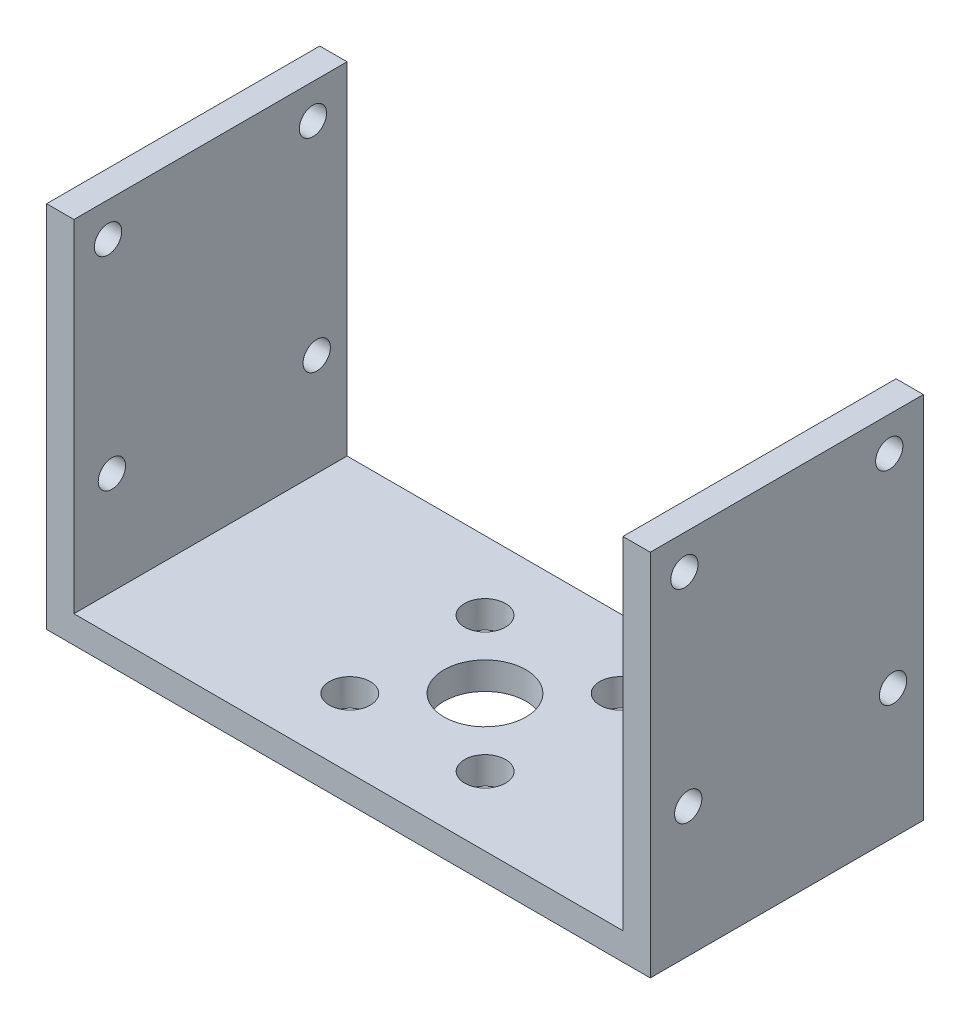
ISO-10303-21;
HEADER;
FILE_DESCRIPTION(('STEP AP214'),'2;1');
FILE_NAME('part.step','',(''),(''),'','','');
FILE_SCHEMA(('AUTOMOTIVE_DESIGN { 1 0 10303 214 1 1 1 1 }'));
ENDSEC;
DATA;
#1=APPLICATION_CONTEXT('core data for automotive mechanical design processes');
#2=APPLICATION_PROTOCOL_DEFINITION('international standard','automotive_design',2000,#1);
#3=PRODUCT_CONTEXT('',#1,'mechanical');
#4=PRODUCT('Part','Part','',(#3));
#5=PRODUCT_RELATED_PRODUCT_CATEGORY('part','',(#4));
#6=PRODUCT_DEFINITION_FORMATION('','',#4);
#7=PRODUCT_DEFINITION_CONTEXT('part definition',#1,'design');
#8=PRODUCT_DEFINITION('design','',#6,#7);
#9=PRODUCT_DEFINITION_SHAPE('','',#8);
#10=(LENGTH_UNIT() NAMED_UNIT(*) SI_UNIT(.MILLI.,.METRE.));
#11=(NAMED_UNIT(*) PLANE_ANGLE_UNIT() SI_UNIT($,.RADIAN.));
#12=(NAMED_UNIT(*) SI_UNIT($,.STERADIAN.) SOLID_ANGLE_UNIT());
#13=UNCERTAINTY_MEASURE_WITH_UNIT(LENGTH_MEASURE(1.E-05),#10,'distance_accuracy_value','');
#14=(GEOMETRIC_REPRESENTATION_CONTEXT(3) GLOBAL_UNCERTAINTY_ASSIGNED_CONTEXT((#13)) GLOBAL_UNIT_ASSIGNED_CONTEXT((#10,
#11,#12)) REPRESENTATION_CONTEXT('',''));
#15=CARTESIAN_POINT('',(0.,0.,0.));
#16=DIRECTION('',(0.,0.,1.));
#17=DIRECTION('',(1.,0.,0.));
#18=AXIS2_PLACEMENT_3D('',#15,#16,#17);
#19=CARTESIAN_POINT('',(0.,2.,0.));
#20=DIRECTION('',(0.,-1.,0.));
#21=DIRECTION('',(0.,0.,-1.));
#22=AXIS2_PLACEMENT_3D('',#19,#20,#21);
#23=PLANE('',#22);
#24=CARTESIAN_POINT('',(27.0495,2.,-14.9495));
#25=DIRECTION('',(0.,1.,0.));
#26=DIRECTION('',(0.,0.,1.));
#27=AXIS2_PLACEMENT_3D('',#24,#25,#26);
#28=CIRCLE('',#27,1.5);
#29=CARTESIAN_POINT('',(27.0495,2.,-13.4495));
#30=VERTEX_POINT('',#29);
#31=EDGE_CURVE('E205',#30,#30,#28,.T.);
#32=ORIENTED_EDGE('',*,*,#31,.F.);
#33=EDGE_LOOP('',(#32));
#34=FACE_BOUND('',#33,.T.);
#35=CARTESIAN_POINT('',(27.0495,2.,-5.0595));
#36=DIRECTION('',(0.,1.,0.));
#37=DIRECTION('',(0.,0.,1.));
#38=AXIS2_PLACEMENT_3D('',#35,#36,#37);
#39=CIRCLE('',#38,1.5);
#40=CARTESIAN_POINT('',(27.0495,2.,-3.5595));
#41=VERTEX_POINT('',#40);
#42=EDGE_CURVE('E212',#41,#41,#39,.T.);
#43=ORIENTED_EDGE('',*,*,#42,.F.);
#44=EDGE_LOOP('',(#43));
#45=FACE_BOUND('',#44,.T.);
#46=CARTESIAN_POINT('',(17.1505,2.,-5.0505));
#47=DIRECTION('',(0.,1.,0.));
#48=DIRECTION('',(0.,0.,1.));
#49=AXIS2_PLACEMENT_3D('',#46,#47,#48);
#50=CIRCLE('',#49,1.5);
#51=CARTESIAN_POINT('',(17.1505,2.,-3.5505));
#52=VERTEX_POINT('',#51);
#53=EDGE_CURVE('E209',#52,#52,#50,.T.);
#54=ORIENTED_EDGE('',*,*,#53,.F.);
#55=EDGE_LOOP('',(#54));
#56=FACE_BOUND('',#55,.T.);
#57=CARTESIAN_POINT('',(17.1505,2.,-14.9495));
#58=DIRECTION('',(0.,1.,0.));
#59=DIRECTION('',(0.,0.,1.));
#60=AXIS2_PLACEMENT_3D('',#57,#58,#59);
#61=CIRCLE('',#60,1.5);
#62=CARTESIAN_POINT('',(17.1505,2.,-13.4495));
#63=VERTEX_POINT('',#62);
#64=EDGE_CURVE('E206',#63,#63,#61,.T.);
#65=ORIENTED_EDGE('',*,*,#64,.F.);
#66=EDGE_LOOP('',(#65));
#67=FACE_BOUND('',#66,.T.);
#68=CARTESIAN_POINT('',(22.1,2.,-10.));
#69=DIRECTION('',(0.,1.,0.));
#70=DIRECTION('',(0.,0.,1.));
#71=AXIS2_PLACEMENT_3D('',#68,#69,#70);
#72=CIRCLE('',#71,2.99999999999999);
#73=CARTESIAN_POINT('',(22.1,2.,-7.00000000000001));
#74=VERTEX_POINT('',#73);
#75=EDGE_CURVE('E126',#74,#74,#72,.T.);
#76=ORIENTED_EDGE('',*,*,#75,.F.);
#77=EDGE_LOOP('',(#76));
#78=FACE_BOUND('',#77,.T.);
#79=DIRECTION('',(0.,0.,1.));
#80=VECTOR('',#79,1.);
#81=CARTESIAN_POINT('',(42.2,2.,-20.));
#82=LINE('',#81,#80);
#83=CARTESIAN_POINT('',(42.2,2.,-20.));
#84=VERTEX_POINT('',#83);
#85=CARTESIAN_POINT('',(42.2,2.,0.));
#86=VERTEX_POINT('',#85);
#87=EDGE_CURVE('E121',#84,#86,#82,.T.);
#88=ORIENTED_EDGE('',*,*,#87,.F.);
#89=DIRECTION('',(-1.,0.,0.));
#90=VECTOR('',#89,1.);
#91=CARTESIAN_POINT('',(0.,2.,-20.));
#92=LINE('',#91,#90);
#93=CARTESIAN_POINT('',(2.,2.,-20.));
#94=VERTEX_POINT('',#93);
#95=EDGE_CURVE('E154',#84,#94,#92,.T.);
#96=ORIENTED_EDGE('',*,*,#95,.T.);
#97=DIRECTION('',(0.,0.,-1.));
#98=VECTOR('',#97,1.);
#99=CARTESIAN_POINT('',(2.,2.,-20.));
#100=LINE('',#99,#98);
#101=CARTESIAN_POINT('',(2.,2.,0.));
#102=VERTEX_POINT('',#101);
#103=EDGE_CURVE('E52',#102,#94,#100,.T.);
#104=ORIENTED_EDGE('',*,*,#103,.F.);
#105=DIRECTION('',(1.,0.,0.));
#106=VECTOR('',#105,1.);
#107=CARTESIAN_POINT('',(0.,2.,0.));
#108=LINE('',#107,#106);
#109=EDGE_CURVE('E47',#102,#86,#108,.T.);
#110=ORIENTED_EDGE('',*,*,#109,.T.);
#111=EDGE_LOOP('',(#88,#96,#104,#110));
#112=FACE_BOUND('',#111,.T.);
#113=ADVANCED_FACE('F30',(#34,#45,#56,#67,#78,#112),#23,.F.);
#114=CARTESIAN_POINT('',(0.,2.,0.));
#115=DIRECTION('',(1.,0.,0.));
#116=DIRECTION('',(0.,0.,-1.));
#117=AXIS2_PLACEMENT_3D('',#114,#115,#116);
#118=PLANE('',#117);
#119=CARTESIAN_POINT('',(0.,9.50000000000001,-2.77964680806756));
#120=DIRECTION('',(-1.,0.,0.));
#121=DIRECTION('',(0.,0.,1.));
#122=AXIS2_PLACEMENT_3D('',#119,#120,#121);
#123=CIRCLE('',#122,1.);
#124=CARTESIAN_POINT('',(0.,9.50000000000001,-1.77964680806756));
#125=VERTEX_POINT('',#124);
#126=EDGE_CURVE('E276',#125,#125,#123,.T.);
#127=ORIENTED_EDGE('',*,*,#126,.F.);
#128=EDGE_LOOP('',(#127));
#129=FACE_BOUND('',#128,.T.);
#130=CARTESIAN_POINT('',(0.,24.5,-17.5));
#131=DIRECTION('',(-1.,0.,0.));
#132=DIRECTION('',(0.,0.,1.));
#133=AXIS2_PLACEMENT_3D('',#130,#131,#132);
#134=CIRCLE('',#133,1.);
#135=CARTESIAN_POINT('',(0.,24.5,-16.5));
#136=VERTEX_POINT('',#135);
#137=EDGE_CURVE('E280',#136,#136,#134,.T.);
#138=ORIENTED_EDGE('',*,*,#137,.F.);
#139=EDGE_LOOP('',(#138));
#140=FACE_BOUND('',#139,.T.);
#141=CARTESIAN_POINT('',(0.,9.50000000000001,-17.7796468080676));
#142=DIRECTION('',(-1.,0.,0.));
#143=DIRECTION('',(0.,0.,1.));
#144=AXIS2_PLACEMENT_3D('',#141,#142,#143);
#145=CIRCLE('',#144,1.);
#146=CARTESIAN_POINT('',(0.,9.50000000000001,-16.7796468080676));
#147=VERTEX_POINT('',#146);
#148=EDGE_CURVE('E284',#147,#147,#145,.T.);
#149=ORIENTED_EDGE('',*,*,#148,.F.);
#150=EDGE_LOOP('',(#149));
#151=FACE_BOUND('',#150,.T.);
#152=CARTESIAN_POINT('',(0.,24.5,-2.5));
#153=DIRECTION('',(-1.,0.,0.));
#154=DIRECTION('',(0.,0.,1.));
#155=AXIS2_PLACEMENT_3D('',#152,#153,#154);
#156=CIRCLE('',#155,1.);
#157=CARTESIAN_POINT('',(0.,24.5,-1.5));
#158=VERTEX_POINT('',#157);
#159=EDGE_CURVE('E287',#158,#158,#156,.T.);
#160=ORIENTED_EDGE('',*,*,#159,.F.);
#161=EDGE_LOOP('',(#160));
#162=FACE_BOUND('',#161,.T.);
#163=DIRECTION('',(0.,0.,1.));
#164=VECTOR('',#163,1.);
#165=CARTESIAN_POINT('',(0.,0.,0.));
#166=LINE('',#165,#164);
#167=CARTESIAN_POINT('',(0.,0.,-20.));
#168=VERTEX_POINT('',#167);
#169=CARTESIAN_POINT('',(0.,0.,0.));
#170=VERTEX_POINT('',#169);
#171=EDGE_CURVE('E152',#168,#170,#166,.T.);
#172=ORIENTED_EDGE('',*,*,#171,.T.);
#173=DIRECTION('',(0.,-1.,0.));
#174=VECTOR('',#173,1.);
#175=CARTESIAN_POINT('',(0.,2.,0.));
#176=LINE('',#175,#174);
#177=CARTESIAN_POINT('',(0.,27.,0.));
#178=VERTEX_POINT('',#177);
#179=EDGE_CURVE('E11',#178,#170,#176,.T.);
#180=ORIENTED_EDGE('',*,*,#179,.F.);
#181=DIRECTION('',(0.,0.,1.));
#182=VECTOR('',#181,1.);
#183=CARTESIAN_POINT('',(0.,27.,-20.));
#184=LINE('',#183,#182);
#185=CARTESIAN_POINT('',(0.,27.,-20.));
#186=VERTEX_POINT('',#185);
#187=EDGE_CURVE('E135',#186,#178,#184,.T.);
#188=ORIENTED_EDGE('',*,*,#187,.F.);
#189=DIRECTION('',(0.,-1.,0.));
#190=VECTOR('',#189,1.);
#191=CARTESIAN_POINT('',(0.,2.,-20.));
#192=LINE('',#191,#190);
#193=EDGE_CURVE('E106',#186,#168,#192,.T.);
#194=ORIENTED_EDGE('',*,*,#193,.T.);
#195=EDGE_LOOP('',(#172,#180,#188,#194));
#196=FACE_BOUND('',#195,.T.);
#197=ADVANCED_FACE('F32',(#129,#140,#151,#162,#196),#118,.F.);
#198=CARTESIAN_POINT('',(0.,2.,0.));
#199=DIRECTION('',(0.,0.,-1.));
#200=DIRECTION('',(-1.,0.,0.));
#201=AXIS2_PLACEMENT_3D('',#198,#199,#200);
#202=PLANE('',#201);
#203=DIRECTION('',(1.,0.,0.));
#204=VECTOR('',#203,1.);
#205=CARTESIAN_POINT('',(0.,0.,0.));
#206=LINE('',#205,#204);
#207=CARTESIAN_POINT('',(44.2,0.,0.));
#208=VERTEX_POINT('',#207);
#209=EDGE_CURVE('E159',#170,#208,#206,.T.);
#210=ORIENTED_EDGE('',*,*,#209,.T.);
#211=DIRECTION('',(0.,-1.,0.));
#212=VECTOR('',#211,1.);
#213=CARTESIAN_POINT('',(44.2,2.,0.));
#214=LINE('',#213,#212);
#215=CARTESIAN_POINT('',(44.2,27.,0.));
#216=VERTEX_POINT('',#215);
#217=EDGE_CURVE('E39',#216,#208,#214,.T.);
#218=ORIENTED_EDGE('',*,*,#217,.F.);
#219=DIRECTION('',(1.,0.,0.));
#220=VECTOR('',#219,1.);
#221=CARTESIAN_POINT('',(44.2,27.,0.));
#222=LINE('',#221,#220);
#223=CARTESIAN_POINT('',(42.2,27.,0.));
#224=VERTEX_POINT('',#223);
#225=EDGE_CURVE('E120',#224,#216,#222,.T.);
#226=ORIENTED_EDGE('',*,*,#225,.F.);
#227=DIRECTION('',(0.,-1.,0.));
#228=VECTOR('',#227,1.);
#229=CARTESIAN_POINT('',(42.2,27.,0.));
#230=LINE('',#229,#228);
#231=EDGE_CURVE('E130',#224,#86,#230,.T.);
#232=ORIENTED_EDGE('',*,*,#231,.T.);
#233=ORIENTED_EDGE('',*,*,#109,.F.);
#234=DIRECTION('',(0.,-1.,0.));
#235=VECTOR('',#234,1.);
#236=CARTESIAN_POINT('',(2.,27.,0.));
#237=LINE('',#236,#235);
#238=CARTESIAN_POINT('',(2.,27.,0.));
#239=VERTEX_POINT('',#238);
#240=EDGE_CURVE('E149',#239,#102,#237,.T.);
#241=ORIENTED_EDGE('',*,*,#240,.F.);
#242=DIRECTION('',(1.,0.,0.));
#243=VECTOR('',#242,1.);
#244=CARTESIAN_POINT('',(0.,27.,0.));
#245=LINE('',#244,#243);
#246=EDGE_CURVE('E138',#178,#239,#245,.T.);
#247=ORIENTED_EDGE('',*,*,#246,.F.);
#248=ORIENTED_EDGE('',*,*,#179,.T.);
#249=EDGE_LOOP('',(#210,#218,#226,#232,#233,#241,#247,#248));
#250=FACE_BOUND('',#249,.T.);
#251=ADVANCED_FACE('F234',(#250),#202,.F.);
#252=CARTESIAN_POINT('',(44.2,2.,0.));
#253=DIRECTION('',(-1.,0.,0.));
#254=DIRECTION('',(0.,0.,1.));
#255=AXIS2_PLACEMENT_3D('',#252,#253,#254);
#256=PLANE('',#255);
#257=CARTESIAN_POINT('',(44.2,9.50000000000001,-2.77964680806756));
#258=DIRECTION('',(-1.,0.,0.));
#259=DIRECTION('',(0.,0.,1.));
#260=AXIS2_PLACEMENT_3D('',#257,#258,#259);
#261=CIRCLE('',#260,1.);
#262=CARTESIAN_POINT('',(44.2,9.50000000000001,-1.77964680806756));
#263=VERTEX_POINT('',#262);
#264=EDGE_CURVE('E289',#263,#263,#261,.T.);
#265=ORIENTED_EDGE('',*,*,#264,.T.);
#266=EDGE_LOOP('',(#265));
#267=FACE_BOUND('',#266,.T.);
#268=CARTESIAN_POINT('',(44.2,24.5,-17.5));
#269=DIRECTION('',(-1.,0.,0.));
#270=DIRECTION('',(0.,0.,1.));
#271=AXIS2_PLACEMENT_3D('',#268,#269,#270);
#272=CIRCLE('',#271,1.);
#273=CARTESIAN_POINT('',(44.2,24.5,-16.5));
#274=VERTEX_POINT('',#273);
#275=EDGE_CURVE('E296',#274,#274,#272,.T.);
#276=ORIENTED_EDGE('',*,*,#275,.T.);
#277=EDGE_LOOP('',(#276));
#278=FACE_BOUND('',#277,.T.);
#279=CARTESIAN_POINT('',(44.2,9.50000000000001,-17.7796468080676));
#280=DIRECTION('',(-1.,0.,0.));
#281=DIRECTION('',(0.,0.,1.));
#282=AXIS2_PLACEMENT_3D('',#279,#280,#281);
#283=CIRCLE('',#282,1.);
#284=CARTESIAN_POINT('',(44.2,9.50000000000001,-16.7796468080676));
#285=VERTEX_POINT('',#284);
#286=EDGE_CURVE('E297',#285,#285,#283,.T.);
#287=ORIENTED_EDGE('',*,*,#286,.T.);
#288=EDGE_LOOP('',(#287));
#289=FACE_BOUND('',#288,.T.);
#290=CARTESIAN_POINT('',(44.2,24.5,-2.5));
#291=DIRECTION('',(-1.,0.,0.));
#292=DIRECTION('',(0.,0.,1.));
#293=AXIS2_PLACEMENT_3D('',#290,#291,#292);
#294=CIRCLE('',#293,1.);
#295=CARTESIAN_POINT('',(44.2,24.5,-1.5));
#296=VERTEX_POINT('',#295);
#297=EDGE_CURVE('E184',#296,#296,#294,.T.);
#298=ORIENTED_EDGE('',*,*,#297,.T.);
#299=EDGE_LOOP('',(#298));
#300=FACE_BOUND('',#299,.T.);
#301=DIRECTION('',(0.,0.,-1.));
#302=VECTOR('',#301,1.);
#303=CARTESIAN_POINT('',(44.2,0.,0.));
#304=LINE('',#303,#302);
#305=CARTESIAN_POINT('',(44.2,0.,-20.));
#306=VERTEX_POINT('',#305);
#307=EDGE_CURVE('E103',#208,#306,#304,.T.);
#308=ORIENTED_EDGE('',*,*,#307,.T.);
#309=DIRECTION('',(0.,-1.,0.));
#310=VECTOR('',#309,1.);
#311=CARTESIAN_POINT('',(44.2,2.,-20.));
#312=LINE('',#311,#310);
#313=CARTESIAN_POINT('',(44.2,27.,-20.));
#314=VERTEX_POINT('',#313);
#315=EDGE_CURVE('E96',#314,#306,#312,.T.);
#316=ORIENTED_EDGE('',*,*,#315,.F.);
#317=DIRECTION('',(0.,0.,-1.));
#318=VECTOR('',#317,1.);
#319=CARTESIAN_POINT('',(44.2,27.,-20.));
#320=LINE('',#319,#318);
#321=EDGE_CURVE('E101',#216,#314,#320,.T.);
#322=ORIENTED_EDGE('',*,*,#321,.F.);
#323=ORIENTED_EDGE('',*,*,#217,.T.);
#324=EDGE_LOOP('',(#308,#316,#322,#323));
#325=FACE_BOUND('',#324,.T.);
#326=ADVANCED_FACE('F98',(#267,#278,#289,#300,#325),#256,.F.);
#327=CARTESIAN_POINT('',(0.,2.,-20.));
#328=DIRECTION('',(0.,0.,1.));
#329=DIRECTION('',(1.,0.,0.));
#330=AXIS2_PLACEMENT_3D('',#327,#328,#329);
#331=PLANE('',#330);
#332=DIRECTION('',(-1.,0.,0.));
#333=VECTOR('',#332,1.);
#334=CARTESIAN_POINT('',(0.,0.,-20.));
#335=LINE('',#334,#333);
#336=EDGE_CURVE('E155',#306,#168,#335,.T.);
#337=ORIENTED_EDGE('',*,*,#336,.T.);
#338=ORIENTED_EDGE('',*,*,#193,.F.);
#339=DIRECTION('',(-1.,0.,0.));
#340=VECTOR('',#339,1.);
#341=CARTESIAN_POINT('',(0.,27.,-20.));
#342=LINE('',#341,#340);
#343=CARTESIAN_POINT('',(2.,27.,-20.));
#344=VERTEX_POINT('',#343);
#345=EDGE_CURVE('E142',#344,#186,#342,.T.);
#346=ORIENTED_EDGE('',*,*,#345,.F.);
#347=DIRECTION('',(0.,-1.,0.));
#348=VECTOR('',#347,1.);
#349=CARTESIAN_POINT('',(2.,27.,-20.));
#350=LINE('',#349,#348);
#351=EDGE_CURVE('E145',#344,#94,#350,.T.);
#352=ORIENTED_EDGE('',*,*,#351,.T.);
#353=ORIENTED_EDGE('',*,*,#95,.F.);
#354=DIRECTION('',(0.,-1.,0.));
#355=VECTOR('',#354,1.);
#356=CARTESIAN_POINT('',(42.2,27.,-20.));
#357=LINE('',#356,#355);
#358=CARTESIAN_POINT('',(42.2,27.,-20.));
#359=VERTEX_POINT('',#358);
#360=EDGE_CURVE('E112',#359,#84,#357,.T.);
#361=ORIENTED_EDGE('',*,*,#360,.F.);
#362=DIRECTION('',(-1.,0.,0.));
#363=VECTOR('',#362,1.);
#364=CARTESIAN_POINT('',(44.2,27.,-20.));
#365=LINE('',#364,#363);
#366=EDGE_CURVE('E109',#314,#359,#365,.T.);
#367=ORIENTED_EDGE('',*,*,#366,.F.);
#368=ORIENTED_EDGE('',*,*,#315,.T.);
#369=EDGE_LOOP('',(#337,#338,#346,#352,#353,#361,#367,#368));
#370=FACE_BOUND('',#369,.T.);
#371=ADVANCED_FACE('F110',(#370),#331,.F.);
#372=CARTESIAN_POINT('',(0.,0.,0.));
#373=DIRECTION('',(0.,-1.,0.));
#374=DIRECTION('',(0.,0.,-1.));
#375=AXIS2_PLACEMENT_3D('',#372,#373,#374);
#376=PLANE('',#375);
#377=CARTESIAN_POINT('',(27.0495,0.,-14.9495));
#378=DIRECTION('',(0.,-1.,0.));
#379=DIRECTION('',(0.,0.,-1.));
#380=AXIS2_PLACEMENT_3D('',#377,#378,#379);
#381=CIRCLE('',#380,1.5);
#382=CARTESIAN_POINT('',(27.0495,0.,-16.4495));
#383=VERTEX_POINT('',#382);
#384=EDGE_CURVE('E123',#383,#383,#381,.T.);
#385=ORIENTED_EDGE('',*,*,#384,.F.);
#386=EDGE_LOOP('',(#385));
#387=FACE_BOUND('',#386,.T.);
#388=CARTESIAN_POINT('',(27.0495,0.,-5.0595));
#389=DIRECTION('',(0.,-1.,0.));
#390=DIRECTION('',(0.,0.,-1.));
#391=AXIS2_PLACEMENT_3D('',#388,#389,#390);
#392=CIRCLE('',#391,1.5);
#393=CARTESIAN_POINT('',(27.0495,0.,-6.5595));
#394=VERTEX_POINT('',#393);
#395=EDGE_CURVE('E175',#394,#394,#392,.T.);
#396=ORIENTED_EDGE('',*,*,#395,.F.);
#397=EDGE_LOOP('',(#396));
#398=FACE_BOUND('',#397,.T.);
#399=CARTESIAN_POINT('',(17.1505,0.,-5.0505));
#400=DIRECTION('',(0.,-1.,0.));
#401=DIRECTION('',(0.,0.,-1.));
#402=AXIS2_PLACEMENT_3D('',#399,#400,#401);
#403=CIRCLE('',#402,1.5);
#404=CARTESIAN_POINT('',(17.1505,0.,-6.5505));
#405=VERTEX_POINT('',#404);
#406=EDGE_CURVE('E172',#405,#405,#403,.T.);
#407=ORIENTED_EDGE('',*,*,#406,.F.);
#408=EDGE_LOOP('',(#407));
#409=FACE_BOUND('',#408,.T.);
#410=CARTESIAN_POINT('',(17.1505,0.,-14.9495));
#411=DIRECTION('',(0.,-1.,0.));
#412=DIRECTION('',(0.,0.,-1.));
#413=AXIS2_PLACEMENT_3D('',#410,#411,#412);
#414=CIRCLE('',#413,1.5);
#415=CARTESIAN_POINT('',(17.1505,0.,-16.4495));
#416=VERTEX_POINT('',#415);
#417=EDGE_CURVE('E169',#416,#416,#414,.T.);
#418=ORIENTED_EDGE('',*,*,#417,.F.);
#419=EDGE_LOOP('',(#418));
#420=FACE_BOUND('',#419,.T.);
#421=CARTESIAN_POINT('',(22.1,0.,-10.));
#422=DIRECTION('',(0.,-1.,0.));
#423=DIRECTION('',(0.,0.,-1.));
#424=AXIS2_PLACEMENT_3D('',#421,#422,#423);
#425=CIRCLE('',#424,2.99999999999999);
#426=CARTESIAN_POINT('',(22.1,0.,-13.));
#427=VERTEX_POINT('',#426);
#428=EDGE_CURVE('E166',#427,#427,#425,.T.);
#429=ORIENTED_EDGE('',*,*,#428,.F.);
#430=EDGE_LOOP('',(#429));
#431=FACE_BOUND('',#430,.T.);
#432=ORIENTED_EDGE('',*,*,#171,.F.);
#433=ORIENTED_EDGE('',*,*,#336,.F.);
#434=ORIENTED_EDGE('',*,*,#307,.F.);
#435=ORIENTED_EDGE('',*,*,#209,.F.);
#436=EDGE_LOOP('',(#432,#433,#434,#435));
#437=FACE_BOUND('',#436,.T.);
#438=ADVANCED_FACE('F237',(#387,#398,#409,#420,#431,#437),#376,.T.);
#439=CARTESIAN_POINT('',(2.,27.,-20.));
#440=DIRECTION('',(-1.,0.,0.));
#441=DIRECTION('',(0.,0.,1.));
#442=AXIS2_PLACEMENT_3D('',#439,#440,#441);
#443=PLANE('',#442);
#444=CARTESIAN_POINT('',(2.,9.50000000000001,-2.77964680806756));
#445=DIRECTION('',(-1.,0.,0.));
#446=DIRECTION('',(0.,0.,1.));
#447=AXIS2_PLACEMENT_3D('',#444,#445,#446);
#448=CIRCLE('',#447,1.);
#449=CARTESIAN_POINT('',(2.,9.50000000000001,-1.77964680806756));
#450=VERTEX_POINT('',#449);
#451=EDGE_CURVE('E202',#450,#450,#448,.T.);
#452=ORIENTED_EDGE('',*,*,#451,.T.);
#453=EDGE_LOOP('',(#452));
#454=FACE_BOUND('',#453,.T.);
#455=CARTESIAN_POINT('',(2.,24.5,-17.5));
#456=DIRECTION('',(-1.,0.,0.));
#457=DIRECTION('',(0.,0.,1.));
#458=AXIS2_PLACEMENT_3D('',#455,#456,#457);
#459=CIRCLE('',#458,1.);
#460=CARTESIAN_POINT('',(2.,24.5,-16.5));
#461=VERTEX_POINT('',#460);
#462=EDGE_CURVE('E190',#461,#461,#459,.T.);
#463=ORIENTED_EDGE('',*,*,#462,.T.);
#464=EDGE_LOOP('',(#463));
#465=FACE_BOUND('',#464,.T.);
#466=CARTESIAN_POINT('',(2.,9.50000000000001,-17.7796468080676));
#467=DIRECTION('',(-1.,0.,0.));
#468=DIRECTION('',(0.,0.,1.));
#469=AXIS2_PLACEMENT_3D('',#466,#467,#468);
#470=CIRCLE('',#469,1.);
#471=CARTESIAN_POINT('',(2.,9.50000000000001,-16.7796468080676));
#472=VERTEX_POINT('',#471);
#473=EDGE_CURVE('E187',#472,#472,#470,.T.);
#474=ORIENTED_EDGE('',*,*,#473,.T.);
#475=EDGE_LOOP('',(#474));
#476=FACE_BOUND('',#475,.T.);
#477=CARTESIAN_POINT('',(2.,24.5,-2.5));
#478=DIRECTION('',(-1.,0.,0.));
#479=DIRECTION('',(0.,0.,1.));
#480=AXIS2_PLACEMENT_3D('',#477,#478,#479);
#481=CIRCLE('',#480,1.);
#482=CARTESIAN_POINT('',(2.,24.5,-1.5));
#483=VERTEX_POINT('',#482);
#484=EDGE_CURVE('E183',#483,#483,#481,.T.);
#485=ORIENTED_EDGE('',*,*,#484,.T.);
#486=EDGE_LOOP('',(#485));
#487=FACE_BOUND('',#486,.T.);
#488=ORIENTED_EDGE('',*,*,#103,.T.);
#489=ORIENTED_EDGE('',*,*,#351,.F.);
#490=DIRECTION('',(0.,0.,-1.));
#491=VECTOR('',#490,1.);
#492=CARTESIAN_POINT('',(2.,27.,-20.));
#493=LINE('',#492,#491);
#494=EDGE_CURVE('E140',#239,#344,#493,.T.);
#495=ORIENTED_EDGE('',*,*,#494,.F.);
#496=ORIENTED_EDGE('',*,*,#240,.T.);
#497=EDGE_LOOP('',(#488,#489,#495,#496));
#498=FACE_BOUND('',#497,.T.);
#499=ADVANCED_FACE('F248',(#454,#465,#476,#487,#498),#443,.F.);
#500=CARTESIAN_POINT('',(0.,27.,0.));
#501=DIRECTION('',(0.,1.,0.));
#502=DIRECTION('',(0.,0.,1.));
#503=AXIS2_PLACEMENT_3D('',#500,#501,#502);
#504=PLANE('',#503);
#505=ORIENTED_EDGE('',*,*,#187,.T.);
#506=ORIENTED_EDGE('',*,*,#246,.T.);
#507=ORIENTED_EDGE('',*,*,#494,.T.);
#508=ORIENTED_EDGE('',*,*,#345,.T.);
#509=EDGE_LOOP('',(#505,#506,#507,#508));
#510=FACE_BOUND('',#509,.T.);
#511=ADVANCED_FACE('F243',(#510),#504,.T.);
#512=CARTESIAN_POINT('',(42.2,27.,-20.));
#513=DIRECTION('',(1.,0.,0.));
#514=DIRECTION('',(0.,0.,-1.));
#515=AXIS2_PLACEMENT_3D('',#512,#513,#514);
#516=PLANE('',#515);
#517=CARTESIAN_POINT('',(42.2,9.50000000000001,-2.77964680806756));
#518=DIRECTION('',(1.,0.,0.));
#519=DIRECTION('',(0.,0.,-1.));
#520=AXIS2_PLACEMENT_3D('',#517,#518,#519);
#521=CIRCLE('',#520,1.);
#522=CARTESIAN_POINT('',(42.2,9.50000000000001,-3.77964680806756));
#523=VERTEX_POINT('',#522);
#524=EDGE_CURVE('E34',#523,#523,#521,.T.);
#525=ORIENTED_EDGE('',*,*,#524,.T.);
#526=EDGE_LOOP('',(#525));
#527=FACE_BOUND('',#526,.T.);
#528=CARTESIAN_POINT('',(42.2,24.5,-17.5));
#529=DIRECTION('',(1.,0.,0.));
#530=DIRECTION('',(0.,0.,-1.));
#531=AXIS2_PLACEMENT_3D('',#528,#529,#530);
#532=CIRCLE('',#531,1.);
#533=CARTESIAN_POINT('',(42.2,24.5,-18.5));
#534=VERTEX_POINT('',#533);
#535=EDGE_CURVE('E188',#534,#534,#532,.T.);
#536=ORIENTED_EDGE('',*,*,#535,.T.);
#537=EDGE_LOOP('',(#536));
#538=FACE_BOUND('',#537,.T.);
#539=CARTESIAN_POINT('',(42.2,9.50000000000001,-17.7796468080676));
#540=DIRECTION('',(1.,0.,0.));
#541=DIRECTION('',(0.,0.,-1.));
#542=AXIS2_PLACEMENT_3D('',#539,#540,#541);
#543=CIRCLE('',#542,1.);
#544=CARTESIAN_POINT('',(42.2,9.50000000000001,-18.7796468080676));
#545=VERTEX_POINT('',#544);
#546=EDGE_CURVE('E185',#545,#545,#543,.T.);
#547=ORIENTED_EDGE('',*,*,#546,.T.);
#548=EDGE_LOOP('',(#547));
#549=FACE_BOUND('',#548,.T.);
#550=CARTESIAN_POINT('',(42.2,24.5,-2.5));
#551=DIRECTION('',(1.,0.,0.));
#552=DIRECTION('',(0.,0.,-1.));
#553=AXIS2_PLACEMENT_3D('',#550,#551,#552);
#554=CIRCLE('',#553,1.);
#555=CARTESIAN_POINT('',(42.2,24.5,-3.5));
#556=VERTEX_POINT('',#555);
#557=EDGE_CURVE('E180',#556,#556,#554,.T.);
#558=ORIENTED_EDGE('',*,*,#557,.T.);
#559=EDGE_LOOP('',(#558));
#560=FACE_BOUND('',#559,.T.);
#561=ORIENTED_EDGE('',*,*,#87,.T.);
#562=ORIENTED_EDGE('',*,*,#231,.F.);
#563=DIRECTION('',(0.,0.,1.));
#564=VECTOR('',#563,1.);
#565=CARTESIAN_POINT('',(42.2,27.,-20.));
#566=LINE('',#565,#564);
#567=EDGE_CURVE('E115',#359,#224,#566,.T.);
#568=ORIENTED_EDGE('',*,*,#567,.F.);
#569=ORIENTED_EDGE('',*,*,#360,.T.);
#570=EDGE_LOOP('',(#561,#562,#568,#569));
#571=FACE_BOUND('',#570,.T.);
#572=ADVANCED_FACE('F232',(#527,#538,#549,#560,#571),#516,.F.);
#573=CARTESIAN_POINT('',(0.,27.,0.));
#574=DIRECTION('',(0.,-1.,0.));
#575=DIRECTION('',(0.,0.,-1.));
#576=AXIS2_PLACEMENT_3D('',#573,#574,#575);
#577=PLANE('',#576);
#578=ORIENTED_EDGE('',*,*,#321,.T.);
#579=ORIENTED_EDGE('',*,*,#366,.T.);
#580=ORIENTED_EDGE('',*,*,#567,.T.);
#581=ORIENTED_EDGE('',*,*,#225,.T.);
#582=EDGE_LOOP('',(#578,#579,#580,#581));
#583=FACE_BOUND('',#582,.T.);
#584=ADVANCED_FACE('F118',(#583),#577,.F.);
#585=CARTESIAN_POINT('',(22.1,-23.,-10.));
#586=DIRECTION('',(0.,1.,0.));
#587=DIRECTION('',(0.,0.,1.));
#588=AXIS2_PLACEMENT_3D('',#585,#586,#587);
#589=CYLINDRICAL_SURFACE('',#588,2.99999999999999);
#590=ORIENTED_EDGE('',*,*,#428,.T.);
#591=EDGE_LOOP('',(#590));
#592=FACE_BOUND('',#591,.T.);
#593=ORIENTED_EDGE('',*,*,#75,.T.);
#594=EDGE_LOOP('',(#593));
#595=FACE_BOUND('',#594,.T.);
#596=ADVANCED_FACE('F460',(#592,#595),#589,.F.);
#597=CARTESIAN_POINT('',(17.1505,-23.,-14.9495));
#598=DIRECTION('',(0.,1.,0.));
#599=DIRECTION('',(0.,0.,1.));
#600=AXIS2_PLACEMENT_3D('',#597,#598,#599);
#601=CYLINDRICAL_SURFACE('',#600,1.5);
#602=ORIENTED_EDGE('',*,*,#417,.T.);
#603=EDGE_LOOP('',(#602));
#604=FACE_BOUND('',#603,.T.);
#605=ORIENTED_EDGE('',*,*,#64,.T.);
#606=EDGE_LOOP('',(#605));
#607=FACE_BOUND('',#606,.T.);
#608=ADVANCED_FACE('F450',(#604,#607),#601,.F.);
#609=CARTESIAN_POINT('',(17.1505,-23.,-5.0505));
#610=DIRECTION('',(0.,1.,0.));
#611=DIRECTION('',(0.,0.,1.));
#612=AXIS2_PLACEMENT_3D('',#609,#610,#611);
#613=CYLINDRICAL_SURFACE('',#612,1.5);
#614=ORIENTED_EDGE('',*,*,#406,.T.);
#615=EDGE_LOOP('',(#614));
#616=FACE_BOUND('',#615,.T.);
#617=ORIENTED_EDGE('',*,*,#53,.T.);
#618=EDGE_LOOP('',(#617));
#619=FACE_BOUND('',#618,.T.);
#620=ADVANCED_FACE('F440',(#616,#619),#613,.F.);
#621=CARTESIAN_POINT('',(27.0495,-23.,-5.0595));
#622=DIRECTION('',(0.,1.,0.));
#623=DIRECTION('',(0.,0.,1.));
#624=AXIS2_PLACEMENT_3D('',#621,#622,#623);
#625=CYLINDRICAL_SURFACE('',#624,1.5);
#626=ORIENTED_EDGE('',*,*,#395,.T.);
#627=EDGE_LOOP('',(#626));
#628=FACE_BOUND('',#627,.T.);
#629=ORIENTED_EDGE('',*,*,#42,.T.);
#630=EDGE_LOOP('',(#629));
#631=FACE_BOUND('',#630,.T.);
#632=ADVANCED_FACE('F328',(#628,#631),#625,.F.);
#633=CARTESIAN_POINT('',(27.0495,-23.,-14.9495));
#634=DIRECTION('',(0.,1.,0.));
#635=DIRECTION('',(0.,0.,1.));
#636=AXIS2_PLACEMENT_3D('',#633,#634,#635);
#637=CYLINDRICAL_SURFACE('',#636,1.5);
#638=ORIENTED_EDGE('',*,*,#384,.T.);
#639=EDGE_LOOP('',(#638));
#640=FACE_BOUND('',#639,.T.);
#641=ORIENTED_EDGE('',*,*,#31,.T.);
#642=EDGE_LOOP('',(#641));
#643=FACE_BOUND('',#642,.T.);
#644=ADVANCED_FACE('F217',(#640,#643),#637,.F.);
#645=CARTESIAN_POINT('',(44.2,24.5,-2.5));
#646=DIRECTION('',(-1.,0.,0.));
#647=DIRECTION('',(0.,0.,1.));
#648=AXIS2_PLACEMENT_3D('',#645,#646,#647);
#649=CYLINDRICAL_SURFACE('',#648,1.);
#650=ORIENTED_EDGE('',*,*,#297,.F.);
#651=EDGE_LOOP('',(#650));
#652=FACE_BOUND('',#651,.T.);
#653=ORIENTED_EDGE('',*,*,#557,.F.);
#654=EDGE_LOOP('',(#653));
#655=FACE_BOUND('',#654,.T.);
#656=ADVANCED_FACE('F311',(#652,#655),#649,.F.);
#657=CARTESIAN_POINT('',(44.2,9.50000000000001,-17.7796468080676));
#658=DIRECTION('',(-1.,0.,0.));
#659=DIRECTION('',(0.,0.,1.));
#660=AXIS2_PLACEMENT_3D('',#657,#658,#659);
#661=CYLINDRICAL_SURFACE('',#660,1.);
#662=ORIENTED_EDGE('',*,*,#286,.F.);
#663=EDGE_LOOP('',(#662));
#664=FACE_BOUND('',#663,.T.);
#665=ORIENTED_EDGE('',*,*,#546,.F.);
#666=EDGE_LOOP('',(#665));
#667=FACE_BOUND('',#666,.T.);
#668=ADVANCED_FACE('F307',(#664,#667),#661,.F.);
#669=CARTESIAN_POINT('',(44.2,24.5,-17.5));
#670=DIRECTION('',(-1.,0.,0.));
#671=DIRECTION('',(0.,0.,1.));
#672=AXIS2_PLACEMENT_3D('',#669,#670,#671);
#673=CYLINDRICAL_SURFACE('',#672,1.);
#674=ORIENTED_EDGE('',*,*,#275,.F.);
#675=EDGE_LOOP('',(#674));
#676=FACE_BOUND('',#675,.T.);
#677=ORIENTED_EDGE('',*,*,#535,.F.);
#678=EDGE_LOOP('',(#677));
#679=FACE_BOUND('',#678,.T.);
#680=ADVANCED_FACE('F310',(#676,#679),#673,.F.);
#681=CARTESIAN_POINT('',(44.2,9.50000000000001,-2.77964680806756));
#682=DIRECTION('',(-1.,0.,0.));
#683=DIRECTION('',(0.,0.,1.));
#684=AXIS2_PLACEMENT_3D('',#681,#682,#683);
#685=CYLINDRICAL_SURFACE('',#684,1.);
#686=ORIENTED_EDGE('',*,*,#264,.F.);
#687=EDGE_LOOP('',(#686));
#688=FACE_BOUND('',#687,.T.);
#689=ORIENTED_EDGE('',*,*,#524,.F.);
#690=EDGE_LOOP('',(#689));
#691=FACE_BOUND('',#690,.T.);
#692=ADVANCED_FACE('F335',(#688,#691),#685,.F.);
#693=ORIENTED_EDGE('',*,*,#159,.T.);
#694=EDGE_LOOP('',(#693));
#695=FACE_BOUND('',#694,.T.);
#696=ORIENTED_EDGE('',*,*,#484,.F.);
#697=EDGE_LOOP('',(#696));
#698=FACE_BOUND('',#697,.T.);
#699=ADVANCED_FACE('F324',(#695,#698),#649,.F.);
#700=ORIENTED_EDGE('',*,*,#148,.T.);
#701=EDGE_LOOP('',(#700));
#702=FACE_BOUND('',#701,.T.);
#703=ORIENTED_EDGE('',*,*,#473,.F.);
#704=EDGE_LOOP('',(#703));
#705=FACE_BOUND('',#704,.T.);
#706=ADVANCED_FACE('F313',(#702,#705),#661,.F.);
#707=ORIENTED_EDGE('',*,*,#137,.T.);
#708=EDGE_LOOP('',(#707));
#709=FACE_BOUND('',#708,.T.);
#710=ORIENTED_EDGE('',*,*,#462,.F.);
#711=EDGE_LOOP('',(#710));
#712=FACE_BOUND('',#711,.T.);
#713=ADVANCED_FACE('F340',(#709,#712),#673,.F.);
#714=ORIENTED_EDGE('',*,*,#126,.T.);
#715=EDGE_LOOP('',(#714));
#716=FACE_BOUND('',#715,.T.);
#717=ORIENTED_EDGE('',*,*,#451,.F.);
#718=EDGE_LOOP('',(#717));
#719=FACE_BOUND('',#718,.T.);
#720=ADVANCED_FACE('F344',(#716,#719),#685,.F.);
#721=CLOSED_SHELL('',(#113,#197,#251,#326,#371,#438,#499,#511,#572,#584,#596,#608,#620,#632,
#644,#656,#668,#680,#692,#699,#706,#713,#720));
#722=MANIFOLD_SOLID_BREP('B2',#721);
#723=ADVANCED_BREP_SHAPE_REPRESENTATION('',(#18,#722),#14);
#724=SHAPE_DEFINITION_REPRESENTATION(#9,#723);
ENDSEC;
END-ISO-10303-21;
